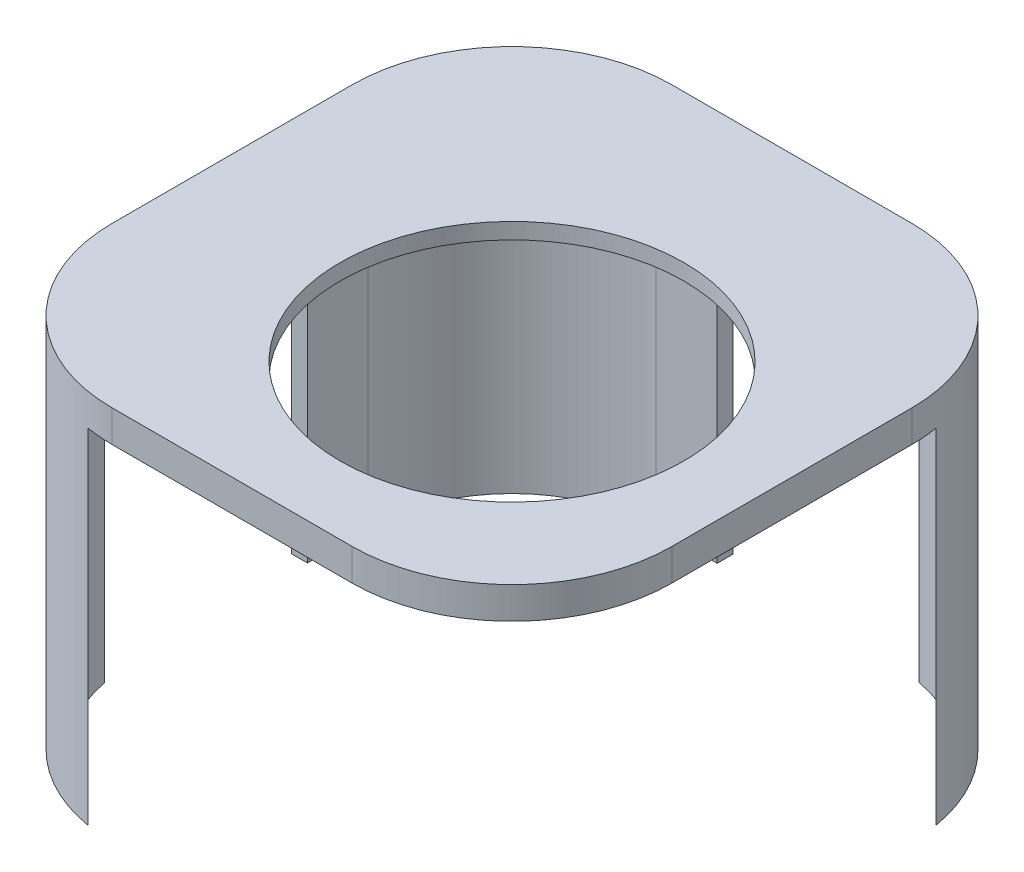
ISO-10303-21;
HEADER;
FILE_DESCRIPTION(('STEP AP214'),'2;1');
FILE_NAME('part.step','',(''),(''),'','','');
FILE_SCHEMA(('AUTOMOTIVE_DESIGN { 1 0 10303 214 1 1 1 1 }'));
ENDSEC;
DATA;
#1=APPLICATION_CONTEXT('core data for automotive mechanical design processes');
#2=APPLICATION_PROTOCOL_DEFINITION('international standard','automotive_design',2000,#1);
#3=PRODUCT_CONTEXT('',#1,'mechanical');
#4=PRODUCT('Part','Part','',(#3));
#5=PRODUCT_RELATED_PRODUCT_CATEGORY('part','',(#4));
#6=PRODUCT_DEFINITION_FORMATION('','',#4);
#7=PRODUCT_DEFINITION_CONTEXT('part definition',#1,'design');
#8=PRODUCT_DEFINITION('design','',#6,#7);
#9=PRODUCT_DEFINITION_SHAPE('','',#8);
#10=(LENGTH_UNIT() NAMED_UNIT(*) SI_UNIT(.MILLI.,.METRE.));
#11=(NAMED_UNIT(*) PLANE_ANGLE_UNIT() SI_UNIT($,.RADIAN.));
#12=(NAMED_UNIT(*) SI_UNIT($,.STERADIAN.) SOLID_ANGLE_UNIT());
#13=UNCERTAINTY_MEASURE_WITH_UNIT(LENGTH_MEASURE(1.E-05),#10,'distance_accuracy_value','');
#14=(GEOMETRIC_REPRESENTATION_CONTEXT(3) GLOBAL_UNCERTAINTY_ASSIGNED_CONTEXT((#13)) GLOBAL_UNIT_ASSIGNED_CONTEXT((#10,
#11,#12)) REPRESENTATION_CONTEXT('',''));
#15=CARTESIAN_POINT('',(0.,0.,0.));
#16=DIRECTION('',(0.,0.,1.));
#17=DIRECTION('',(1.,0.,0.));
#18=AXIS2_PLACEMENT_3D('',#15,#16,#17);
#19=CARTESIAN_POINT('',(0.,0.,0.));
#20=DIRECTION('',(0.,-1.,0.));
#21=DIRECTION('',(0.,0.,-1.));
#22=AXIS2_PLACEMENT_3D('',#19,#20,#21);
#23=PLANE('',#22);
#24=DIRECTION('',(0.,0.,1.));
#25=VECTOR('',#24,1.);
#26=CARTESIAN_POINT('',(-33.,0.,0.));
#27=LINE('',#26,#25);
#28=CARTESIAN_POINT('',(-33.,0.,-15.));
#29=VERTEX_POINT('',#28);
#30=CARTESIAN_POINT('',(-33.,0.,-7.41026140293855));
#31=VERTEX_POINT('',#30);
#32=EDGE_CURVE('E319',#29,#31,#27,.T.);
#33=ORIENTED_EDGE('',*,*,#32,.T.);
#34=DIRECTION('',(-1.,0.,0.));
#35=VECTOR('',#34,1.);
#36=CARTESIAN_POINT('',(-25.,0.,-7.41026140293855));
#37=LINE('',#36,#35);
#38=CARTESIAN_POINT('',(-35.,0.,-7.41026140293855));
#39=VERTEX_POINT('',#38);
#40=EDGE_CURVE('E223',#31,#39,#37,.T.);
#41=ORIENTED_EDGE('',*,*,#40,.T.);
#42=DIRECTION('',(0.,0.,1.));
#43=VECTOR('',#42,1.);
#44=CARTESIAN_POINT('',(-35.,0.,35.));
#45=LINE('',#44,#43);
#46=CARTESIAN_POINT('',(-35.,0.,-15.));
#47=VERTEX_POINT('',#46);
#48=EDGE_CURVE('E239',#47,#39,#45,.T.);
#49=ORIENTED_EDGE('',*,*,#48,.F.);
#50=CARTESIAN_POINT('',(-15.,0.,-15.));
#51=DIRECTION('',(0.,-1.,0.));
#52=DIRECTION('',(0.,0.,-1.));
#53=AXIS2_PLACEMENT_3D('',#50,#51,#52);
#54=CIRCLE('',#53,20.);
#55=CARTESIAN_POINT('',(-15.,0.,-35.));
#56=VERTEX_POINT('',#55);
#57=EDGE_CURVE('E389',#47,#56,#54,.T.);
#58=ORIENTED_EDGE('',*,*,#57,.T.);
#59=DIRECTION('',(-1.,0.,0.));
#60=VECTOR('',#59,1.);
#61=CARTESIAN_POINT('',(-35.,0.,-35.));
#62=LINE('',#61,#60);
#63=CARTESIAN_POINT('',(-7.33521783819668,0.,-35.));
#64=VERTEX_POINT('',#63);
#65=EDGE_CURVE('E346',#64,#56,#62,.T.);
#66=ORIENTED_EDGE('',*,*,#65,.F.);
#67=DIRECTION('',(0.,0.,-1.));
#68=VECTOR('',#67,1.);
#69=CARTESIAN_POINT('',(-7.33521783819668,0.,-25.));
#70=LINE('',#69,#68);
#71=CARTESIAN_POINT('',(-7.33521783819668,0.,-33.));
#72=VERTEX_POINT('',#71);
#73=EDGE_CURVE('E257',#72,#64,#70,.T.);
#74=ORIENTED_EDGE('',*,*,#73,.F.);
#75=DIRECTION('',(-1.,0.,0.));
#76=VECTOR('',#75,1.);
#77=CARTESIAN_POINT('',(0.,0.,-33.));
#78=LINE('',#77,#76);
#79=CARTESIAN_POINT('',(-15.,0.,-33.));
#80=VERTEX_POINT('',#79);
#81=EDGE_CURVE('E363',#72,#80,#78,.T.);
#82=ORIENTED_EDGE('',*,*,#81,.T.);
#83=CARTESIAN_POINT('',(-15.,0.,-15.));
#84=DIRECTION('',(0.,-1.,0.));
#85=DIRECTION('',(0.,0.,-1.));
#86=AXIS2_PLACEMENT_3D('',#83,#84,#85);
#87=CIRCLE('',#86,18.);
#88=EDGE_CURVE('E360',#29,#80,#87,.T.);
#89=ORIENTED_EDGE('',*,*,#88,.F.);
#90=EDGE_LOOP('',(#33,#41,#49,#58,#66,#74,#82,#89));
#91=FACE_BOUND('',#90,.T.);
#92=ADVANCED_FACE('F33',(#91),#23,.T.);
#93=CARTESIAN_POINT('',(-15.,47.,15.));
#94=DIRECTION('',(0.,-1.,0.));
#95=DIRECTION('',(0.,0.,-1.));
#96=AXIS2_PLACEMENT_3D('',#93,#94,#95);
#97=CYLINDRICAL_SURFACE('',#96,20.);
#98=DIRECTION('',(0.,-1.,0.));
#99=VECTOR('',#98,1.);
#100=CARTESIAN_POINT('',(-35.,47.,15.));
#101=LINE('',#100,#99);
#102=CARTESIAN_POINT('',(-35.,28.5604552285932,15.));
#103=VERTEX_POINT('',#102);
#104=CARTESIAN_POINT('',(-35.,47.,15.));
#105=VERTEX_POINT('',#104);
#106=EDGE_CURVE('E410',#103,#105,#101,.F.);
#107=ORIENTED_EDGE('',*,*,#106,.F.);
#108=CARTESIAN_POINT('',(-15.,28.5604552285932,15.));
#109=DIRECTION('',(0.,-1.,0.));
#110=DIRECTION('',(0.,0.,-1.));
#111=AXIS2_PLACEMENT_3D('',#108,#109,#110);
#112=CIRCLE('',#111,20.);
#113=CARTESIAN_POINT('',(-34.7322185635075,28.5604552285932,18.2618323932981));
#114=VERTEX_POINT('',#113);
#115=EDGE_CURVE('E231',#103,#114,#112,.F.);
#116=ORIENTED_EDGE('',*,*,#115,.T.);
#117=DIRECTION('',(0.,-1.,0.));
#118=VECTOR('',#117,1.);
#119=CARTESIAN_POINT('',(-34.7322185635075,47.,18.2618323932981));
#120=LINE('',#119,#118);
#121=CARTESIAN_POINT('',(-34.7322185635075,0.,18.2618323932981));
#122=VERTEX_POINT('',#121);
#123=EDGE_CURVE('E249',#122,#114,#120,.F.);
#124=ORIENTED_EDGE('',*,*,#123,.F.);
#125=CARTESIAN_POINT('',(-15.,0.,15.));
#126=DIRECTION('',(0.,-1.,0.));
#127=DIRECTION('',(0.,0.,-1.));
#128=AXIS2_PLACEMENT_3D('',#125,#126,#127);
#129=CIRCLE('',#128,20.);
#130=CARTESIAN_POINT('',(-18.3085734447097,0.,34.7244351442814));
#131=VERTEX_POINT('',#130);
#132=EDGE_CURVE('E392',#131,#122,#129,.T.);
#133=ORIENTED_EDGE('',*,*,#132,.F.);
#134=DIRECTION('',(0.,-1.,0.));
#135=VECTOR('',#134,1.);
#136=CARTESIAN_POINT('',(-18.3085734447097,47.,34.7244351442814));
#137=LINE('',#136,#135);
#138=CARTESIAN_POINT('',(-18.3085734447097,43.0241572357972,34.7244351442814));
#139=VERTEX_POINT('',#138);
#140=EDGE_CURVE('E308',#131,#139,#137,.F.);
#141=ORIENTED_EDGE('',*,*,#140,.T.);
#142=CARTESIAN_POINT('',(-15.,43.0241572357972,15.));
#143=DIRECTION('',(0.,-1.,0.));
#144=DIRECTION('',(0.,0.,-1.));
#145=AXIS2_PLACEMENT_3D('',#142,#143,#144);
#146=CIRCLE('',#145,20.);
#147=CARTESIAN_POINT('',(-15.,43.0241572357972,35.));
#148=VERTEX_POINT('',#147);
#149=EDGE_CURVE('E302',#139,#148,#146,.F.);
#150=ORIENTED_EDGE('',*,*,#149,.T.);
#151=DIRECTION('',(0.,-1.,0.));
#152=VECTOR('',#151,1.);
#153=CARTESIAN_POINT('',(-15.,47.,35.));
#154=LINE('',#153,#152);
#155=CARTESIAN_POINT('',(-15.,47.,35.));
#156=VERTEX_POINT('',#155);
#157=EDGE_CURVE('E395',#156,#148,#154,.T.);
#158=ORIENTED_EDGE('',*,*,#157,.F.);
#159=CARTESIAN_POINT('',(-15.,47.,15.));
#160=DIRECTION('',(0.,-1.,0.));
#161=DIRECTION('',(0.,0.,-1.));
#162=AXIS2_PLACEMENT_3D('',#159,#160,#161);
#163=CIRCLE('',#162,20.);
#164=EDGE_CURVE('E404',#105,#156,#163,.F.);
#165=ORIENTED_EDGE('',*,*,#164,.F.);
#166=EDGE_LOOP('',(#107,#116,#124,#133,#141,#150,#158,#165));
#167=FACE_BOUND('',#166,.T.);
#168=ADVANCED_FACE('F468',(#167),#97,.T.);
#169=CARTESIAN_POINT('',(-15.,47.,15.));
#170=DIRECTION('',(0.,-1.,0.));
#171=DIRECTION('',(0.,0.,-1.));
#172=AXIS2_PLACEMENT_3D('',#169,#170,#171);
#173=CYLINDRICAL_SURFACE('',#172,18.);
#174=CARTESIAN_POINT('',(-15.,28.5604552285932,15.));
#175=DIRECTION('',(0.,-1.,0.));
#176=DIRECTION('',(0.,0.,-1.));
#177=AXIS2_PLACEMENT_3D('',#174,#175,#176);
#178=CIRCLE('',#177,18.);
#179=CARTESIAN_POINT('',(-33.,28.5604552285932,15.));
#180=VERTEX_POINT('',#179);
#181=CARTESIAN_POINT('',(-32.7019899852539,28.5604552285932,18.2618323932981));
#182=VERTEX_POINT('',#181);
#183=EDGE_CURVE('E244',#180,#182,#178,.F.);
#184=ORIENTED_EDGE('',*,*,#183,.F.);
#185=DIRECTION('',(0.,1.,0.));
#186=VECTOR('',#185,1.);
#187=CARTESIAN_POINT('',(-33.,47.,15.));
#188=LINE('',#187,#186);
#189=CARTESIAN_POINT('',(-33.,45.,15.));
#190=VERTEX_POINT('',#189);
#191=EDGE_CURVE('E350',#180,#190,#188,.T.);
#192=ORIENTED_EDGE('',*,*,#191,.T.);
#193=CARTESIAN_POINT('',(-15.,45.,15.));
#194=DIRECTION('',(0.,-1.,0.));
#195=DIRECTION('',(0.,0.,-1.));
#196=AXIS2_PLACEMENT_3D('',#193,#194,#195);
#197=CIRCLE('',#196,18.);
#198=CARTESIAN_POINT('',(-15.,45.,33.));
#199=VERTEX_POINT('',#198);
#200=EDGE_CURVE('E333',#190,#199,#197,.F.);
#201=ORIENTED_EDGE('',*,*,#200,.T.);
#202=DIRECTION('',(0.,1.,0.));
#203=VECTOR('',#202,1.);
#204=CARTESIAN_POINT('',(-15.,47.,33.));
#205=LINE('',#204,#203);
#206=CARTESIAN_POINT('',(-15.,43.0241572357972,33.));
#207=VERTEX_POINT('',#206);
#208=EDGE_CURVE('E353',#199,#207,#205,.F.);
#209=ORIENTED_EDGE('',*,*,#208,.T.);
#210=CARTESIAN_POINT('',(-15.,43.0241572357972,15.));
#211=DIRECTION('',(0.,-1.,0.));
#212=DIRECTION('',(0.,0.,-1.));
#213=AXIS2_PLACEMENT_3D('',#210,#211,#212);
#214=CIRCLE('',#213,18.);
#215=CARTESIAN_POINT('',(-21.0970828461428,43.0241572357972,31.9359257428483));
#216=VERTEX_POINT('',#215);
#217=EDGE_CURVE('E290',#216,#207,#214,.F.);
#218=ORIENTED_EDGE('',*,*,#217,.F.);
#219=DIRECTION('',(0.,-1.,0.));
#220=VECTOR('',#219,1.);
#221=CARTESIAN_POINT('',(-21.0970828461428,47.,31.9359257428483));
#222=LINE('',#221,#220);
#223=CARTESIAN_POINT('',(-21.0970828461428,0.,31.9359257428483));
#224=VERTEX_POINT('',#223);
#225=EDGE_CURVE('E424',#224,#216,#222,.F.);
#226=ORIENTED_EDGE('',*,*,#225,.F.);
#227=CARTESIAN_POINT('',(-15.,0.,15.));
#228=DIRECTION('',(0.,-1.,0.));
#229=DIRECTION('',(0.,0.,-1.));
#230=AXIS2_PLACEMENT_3D('',#227,#228,#229);
#231=CIRCLE('',#230,18.);
#232=CARTESIAN_POINT('',(-32.7019899852539,0.,18.2618323932981));
#233=VERTEX_POINT('',#232);
#234=EDGE_CURVE('E356',#224,#233,#231,.T.);
#235=ORIENTED_EDGE('',*,*,#234,.T.);
#236=DIRECTION('',(0.,-1.,0.));
#237=VECTOR('',#236,1.);
#238=CARTESIAN_POINT('',(-32.7019899852539,47.,18.2618323932981));
#239=LINE('',#238,#237);
#240=EDGE_CURVE('E11',#233,#182,#239,.F.);
#241=ORIENTED_EDGE('',*,*,#240,.T.);
#242=EDGE_LOOP('',(#184,#192,#201,#209,#218,#226,#235,#241));
#243=FACE_BOUND('',#242,.T.);
#244=ADVANCED_FACE('F460',(#243),#173,.F.);
#245=CARTESIAN_POINT('',(-35.,47.,35.));
#246=DIRECTION('',(1.,0.,0.));
#247=DIRECTION('',(0.,0.,-1.));
#248=AXIS2_PLACEMENT_3D('',#245,#246,#247);
#249=PLANE('',#248);
#250=DIRECTION('',(0.,1.,0.));
#251=VECTOR('',#250,1.);
#252=CARTESIAN_POINT('',(-35.,0.,-7.41026140293855));
#253=LINE('',#252,#251);
#254=CARTESIAN_POINT('',(-35.,28.5604552285932,-7.41026140293855));
#255=VERTEX_POINT('',#254);
#256=EDGE_CURVE('E219',#39,#255,#253,.T.);
#257=ORIENTED_EDGE('',*,*,#256,.T.);
#258=DIRECTION('',(0.,0.,1.));
#259=VECTOR('',#258,1.);
#260=CARTESIAN_POINT('',(-35.,28.5604552285932,-7.41026140293855));
#261=LINE('',#260,#259);
#262=EDGE_CURVE('E227',#255,#103,#261,.T.);
#263=ORIENTED_EDGE('',*,*,#262,.T.);
#264=ORIENTED_EDGE('',*,*,#106,.T.);
#265=DIRECTION('',(0.,0.,1.));
#266=VECTOR('',#265,1.);
#267=CARTESIAN_POINT('',(-35.,47.,35.));
#268=LINE('',#267,#266);
#269=CARTESIAN_POINT('',(-35.,47.,-15.));
#270=VERTEX_POINT('',#269);
#271=EDGE_CURVE('E374',#270,#105,#268,.T.);
#272=ORIENTED_EDGE('',*,*,#271,.F.);
#273=DIRECTION('',(0.,-1.,0.));
#274=VECTOR('',#273,1.);
#275=CARTESIAN_POINT('',(-35.,47.,-15.));
#276=LINE('',#275,#274);
#277=EDGE_CURVE('E408',#270,#47,#276,.T.);
#278=ORIENTED_EDGE('',*,*,#277,.T.);
#279=ORIENTED_EDGE('',*,*,#48,.T.);
#280=EDGE_LOOP('',(#257,#263,#264,#272,#278,#279));
#281=FACE_BOUND('',#280,.T.);
#282=ADVANCED_FACE('F236',(#281),#249,.F.);
#283=CARTESIAN_POINT('',(-33.,47.,35.));
#284=DIRECTION('',(1.,0.,0.));
#285=DIRECTION('',(0.,0.,-1.));
#286=AXIS2_PLACEMENT_3D('',#283,#284,#285);
#287=PLANE('',#286);
#288=DIRECTION('',(0.,0.,-1.));
#289=VECTOR('',#288,1.);
#290=CARTESIAN_POINT('',(-33.,28.5604552285932,35.));
#291=LINE('',#290,#289);
#292=CARTESIAN_POINT('',(-33.,28.5604552285932,-7.41026140293854));
#293=VERTEX_POINT('',#292);
#294=EDGE_CURVE('E433',#180,#293,#291,.T.);
#295=ORIENTED_EDGE('',*,*,#294,.T.);
#296=DIRECTION('',(0.,-1.,0.));
#297=VECTOR('',#296,1.);
#298=CARTESIAN_POINT('',(-33.,47.,-7.41026140293854));
#299=LINE('',#298,#297);
#300=EDGE_CURVE('E41',#293,#31,#299,.T.);
#301=ORIENTED_EDGE('',*,*,#300,.T.);
#302=ORIENTED_EDGE('',*,*,#32,.F.);
#303=DIRECTION('',(0.,1.,0.));
#304=VECTOR('',#303,1.);
#305=CARTESIAN_POINT('',(-33.,47.,-15.));
#306=LINE('',#305,#304);
#307=CARTESIAN_POINT('',(-33.,45.,-15.));
#308=VERTEX_POINT('',#307);
#309=EDGE_CURVE('E332',#308,#29,#306,.F.);
#310=ORIENTED_EDGE('',*,*,#309,.F.);
#311=DIRECTION('',(0.,0.,1.));
#312=VECTOR('',#311,1.);
#313=CARTESIAN_POINT('',(-33.,45.,0.));
#314=LINE('',#313,#312);
#315=EDGE_CURVE('E329',#308,#190,#314,.T.);
#316=ORIENTED_EDGE('',*,*,#315,.T.);
#317=ORIENTED_EDGE('',*,*,#191,.F.);
#318=EDGE_LOOP('',(#295,#301,#302,#310,#316,#317));
#319=FACE_BOUND('',#318,.T.);
#320=ADVANCED_FACE('F436',(#319),#287,.T.);
#321=DIRECTION('',(-1.,0.,0.));
#322=VECTOR('',#321,1.);
#323=CARTESIAN_POINT('',(-25.,0.,18.2618323932981));
#324=LINE('',#323,#322);
#325=EDGE_CURVE('E240',#233,#122,#324,.T.);
#326=ORIENTED_EDGE('',*,*,#325,.F.);
#327=ORIENTED_EDGE('',*,*,#234,.F.);
#328=DIRECTION('',(-0.707106781186547,0.,-0.707106781186548));
#329=VECTOR('',#328,1.);
#330=CARTESIAN_POINT('',(8.48349570550447,0.,61.5165042944955));
#331=LINE('',#330,#329);
#332=EDGE_CURVE('E274',#131,#224,#331,.T.);
#333=ORIENTED_EDGE('',*,*,#332,.F.);
#334=ORIENTED_EDGE('',*,*,#132,.T.);
#335=EDGE_LOOP('',(#326,#327,#333,#334));
#336=FACE_BOUND('',#335,.T.);
#337=ADVANCED_FACE('F471',(#336),#23,.T.);
#338=DIRECTION('',(0.,0.,-1.));
#339=VECTOR('',#338,1.);
#340=CARTESIAN_POINT('',(18.2134747115512,0.,-25.));
#341=LINE('',#340,#339);
#342=CARTESIAN_POINT('',(18.2134747115512,0.,-32.7108322864348));
#343=VERTEX_POINT('',#342);
#344=CARTESIAN_POINT('',(18.2134747115512,0.,-34.7401514755642));
#345=VERTEX_POINT('',#344);
#346=EDGE_CURVE('E259',#343,#345,#341,.T.);
#347=ORIENTED_EDGE('',*,*,#346,.T.);
#348=CARTESIAN_POINT('',(15.,0.,-15.));
#349=DIRECTION('',(0.,-1.,0.));
#350=DIRECTION('',(0.,0.,-1.));
#351=AXIS2_PLACEMENT_3D('',#348,#349,#350);
#352=CIRCLE('',#351,20.);
#353=CARTESIAN_POINT('',(34.7244351442814,0.,-18.3085734447097));
#354=VERTEX_POINT('',#353);
#355=EDGE_CURVE('E387',#345,#354,#352,.T.);
#356=ORIENTED_EDGE('',*,*,#355,.T.);
#357=DIRECTION('',(-0.707106781186547,0.,-0.707106781186548));
#358=VECTOR('',#357,1.);
#359=CARTESIAN_POINT('',(61.5165042944955,0.,8.48349570550449));
#360=LINE('',#359,#358);
#361=CARTESIAN_POINT('',(31.9359257428483,0.,-21.0970828461427));
#362=VERTEX_POINT('',#361);
#363=EDGE_CURVE('E271',#354,#362,#360,.T.);
#364=ORIENTED_EDGE('',*,*,#363,.T.);
#365=CARTESIAN_POINT('',(15.,0.,-15.));
#366=DIRECTION('',(0.,-1.,0.));
#367=DIRECTION('',(0.,0.,-1.));
#368=AXIS2_PLACEMENT_3D('',#365,#366,#367);
#369=CIRCLE('',#368,18.);
#370=EDGE_CURVE('E323',#343,#362,#369,.T.);
#371=ORIENTED_EDGE('',*,*,#370,.F.);
#372=EDGE_LOOP('',(#347,#356,#364,#371));
#373=FACE_BOUND('',#372,.T.);
#374=ADVANCED_FACE('F541',(#373),#23,.T.);
#375=CARTESIAN_POINT('',(35.,47.,35.));
#376=DIRECTION('',(-1.,0.,0.));
#377=DIRECTION('',(0.,0.,1.));
#378=AXIS2_PLACEMENT_3D('',#375,#376,#377);
#379=PLANE('',#378);
#380=DIRECTION('',(0.,0.,1.));
#381=VECTOR('',#380,1.);
#382=CARTESIAN_POINT('',(35.,43.0241572357972,35.));
#383=LINE('',#382,#381);
#384=CARTESIAN_POINT('',(35.,43.0241572357972,-15.));
#385=VERTEX_POINT('',#384);
#386=CARTESIAN_POINT('',(35.,43.0241572357972,15.));
#387=VERTEX_POINT('',#386);
#388=EDGE_CURVE('E295',#385,#387,#383,.T.);
#389=ORIENTED_EDGE('',*,*,#388,.F.);
#390=DIRECTION('',(0.,-1.,0.));
#391=VECTOR('',#390,1.);
#392=CARTESIAN_POINT('',(35.,47.,-15.));
#393=LINE('',#392,#391);
#394=CARTESIAN_POINT('',(35.,47.,-15.));
#395=VERTEX_POINT('',#394);
#396=EDGE_CURVE('E380',#385,#395,#393,.F.);
#397=ORIENTED_EDGE('',*,*,#396,.T.);
#398=DIRECTION('',(0.,0.,-1.));
#399=VECTOR('',#398,1.);
#400=CARTESIAN_POINT('',(35.,47.,35.));
#401=LINE('',#400,#399);
#402=CARTESIAN_POINT('',(35.,47.,15.));
#403=VERTEX_POINT('',#402);
#404=EDGE_CURVE('E368',#403,#395,#401,.T.);
#405=ORIENTED_EDGE('',*,*,#404,.F.);
#406=DIRECTION('',(0.,-1.,0.));
#407=VECTOR('',#406,1.);
#408=CARTESIAN_POINT('',(35.,47.,15.));
#409=LINE('',#408,#407);
#410=EDGE_CURVE('E384',#403,#387,#409,.T.);
#411=ORIENTED_EDGE('',*,*,#410,.T.);
#412=EDGE_LOOP('',(#389,#397,#405,#411));
#413=FACE_BOUND('',#412,.T.);
#414=ADVANCED_FACE('F508',(#413),#379,.F.);
#415=CARTESIAN_POINT('',(-35.,47.,35.));
#416=DIRECTION('',(0.,0.,-1.));
#417=DIRECTION('',(-1.,0.,0.));
#418=AXIS2_PLACEMENT_3D('',#415,#416,#417);
#419=PLANE('',#418);
#420=DIRECTION('',(-1.,0.,0.));
#421=VECTOR('',#420,1.);
#422=CARTESIAN_POINT('',(-35.,43.0241572357972,35.));
#423=LINE('',#422,#421);
#424=CARTESIAN_POINT('',(15.,43.0241572357972,35.));
#425=VERTEX_POINT('',#424);
#426=EDGE_CURVE('E300',#425,#148,#423,.T.);
#427=ORIENTED_EDGE('',*,*,#426,.F.);
#428=DIRECTION('',(0.,-1.,0.));
#429=VECTOR('',#428,1.);
#430=CARTESIAN_POINT('',(15.,47.,35.));
#431=LINE('',#430,#429);
#432=CARTESIAN_POINT('',(15.,47.,35.));
#433=VERTEX_POINT('',#432);
#434=EDGE_CURVE('E398',#425,#433,#431,.F.);
#435=ORIENTED_EDGE('',*,*,#434,.T.);
#436=DIRECTION('',(1.,0.,0.));
#437=VECTOR('',#436,1.);
#438=CARTESIAN_POINT('',(-35.,47.,35.));
#439=LINE('',#438,#437);
#440=EDGE_CURVE('E377',#156,#433,#439,.T.);
#441=ORIENTED_EDGE('',*,*,#440,.F.);
#442=ORIENTED_EDGE('',*,*,#157,.T.);
#443=EDGE_LOOP('',(#427,#435,#441,#442));
#444=FACE_BOUND('',#443,.T.);
#445=ADVANCED_FACE('F517',(#444),#419,.F.);
#446=CARTESIAN_POINT('',(15.,47.,15.));
#447=DIRECTION('',(0.,-1.,0.));
#448=DIRECTION('',(0.,0.,-1.));
#449=AXIS2_PLACEMENT_3D('',#446,#447,#448);
#450=CYLINDRICAL_SURFACE('',#449,20.);
#451=ORIENTED_EDGE('',*,*,#434,.F.);
#452=CARTESIAN_POINT('',(15.,43.0241572357972,15.));
#453=DIRECTION('',(0.,-1.,0.));
#454=DIRECTION('',(0.,0.,-1.));
#455=AXIS2_PLACEMENT_3D('',#452,#453,#454);
#456=CIRCLE('',#455,20.);
#457=EDGE_CURVE('E297',#425,#387,#456,.F.);
#458=ORIENTED_EDGE('',*,*,#457,.T.);
#459=ORIENTED_EDGE('',*,*,#410,.F.);
#460=CARTESIAN_POINT('',(15.,47.,15.));
#461=DIRECTION('',(0.,-1.,0.));
#462=DIRECTION('',(0.,0.,-1.));
#463=AXIS2_PLACEMENT_3D('',#460,#461,#462);
#464=CIRCLE('',#463,20.);
#465=EDGE_CURVE('E406',#433,#403,#464,.F.);
#466=ORIENTED_EDGE('',*,*,#465,.F.);
#467=EDGE_LOOP('',(#451,#458,#459,#466));
#468=FACE_BOUND('',#467,.T.);
#469=ADVANCED_FACE('F514',(#468),#450,.T.);
#470=CARTESIAN_POINT('',(15.,47.,-15.));
#471=DIRECTION('',(0.,-1.,0.));
#472=DIRECTION('',(0.,0.,-1.));
#473=AXIS2_PLACEMENT_3D('',#470,#471,#472);
#474=CYLINDRICAL_SURFACE('',#473,20.);
#475=DIRECTION('',(0.,-1.,0.));
#476=VECTOR('',#475,1.);
#477=CARTESIAN_POINT('',(18.2134747115512,47.,-34.7401514755642));
#478=LINE('',#477,#476);
#479=CARTESIAN_POINT('',(18.2134747115512,28.8007936659369,-34.7401514755642));
#480=VERTEX_POINT('',#479);
#481=EDGE_CURVE('E269',#480,#345,#478,.T.);
#482=ORIENTED_EDGE('',*,*,#481,.F.);
#483=CARTESIAN_POINT('',(15.,28.8007936659369,-15.));
#484=DIRECTION('',(0.,1.,0.));
#485=DIRECTION('',(-1.,0.,0.));
#486=AXIS2_PLACEMENT_3D('',#483,#484,#485);
#487=CIRCLE('',#486,20.);
#488=CARTESIAN_POINT('',(15.,28.8007936659369,-35.));
#489=VERTEX_POINT('',#488);
#490=EDGE_CURVE('E267',#489,#480,#487,.F.);
#491=ORIENTED_EDGE('',*,*,#490,.F.);
#492=DIRECTION('',(0.,-1.,0.));
#493=VECTOR('',#492,1.);
#494=CARTESIAN_POINT('',(15.,47.,-35.));
#495=LINE('',#494,#493);
#496=CARTESIAN_POINT('',(15.,47.,-35.));
#497=VERTEX_POINT('',#496);
#498=EDGE_CURVE('E412',#497,#489,#495,.T.);
#499=ORIENTED_EDGE('',*,*,#498,.F.);
#500=CARTESIAN_POINT('',(15.,47.,-15.));
#501=DIRECTION('',(0.,-1.,0.));
#502=DIRECTION('',(0.,0.,-1.));
#503=AXIS2_PLACEMENT_3D('',#500,#501,#502);
#504=CIRCLE('',#503,20.);
#505=EDGE_CURVE('E400',#395,#497,#504,.F.);
#506=ORIENTED_EDGE('',*,*,#505,.F.);
#507=ORIENTED_EDGE('',*,*,#396,.F.);
#508=CARTESIAN_POINT('',(15.,43.0241572357972,-15.));
#509=DIRECTION('',(0.,-1.,0.));
#510=DIRECTION('',(0.,0.,-1.));
#511=AXIS2_PLACEMENT_3D('',#508,#509,#510);
#512=CIRCLE('',#511,20.);
#513=CARTESIAN_POINT('',(34.7244351442814,43.0241572357972,-18.3085734447097));
#514=VERTEX_POINT('',#513);
#515=EDGE_CURVE('E292',#385,#514,#512,.F.);
#516=ORIENTED_EDGE('',*,*,#515,.T.);
#517=DIRECTION('',(0.,-1.,0.));
#518=VECTOR('',#517,1.);
#519=CARTESIAN_POINT('',(34.7244351442814,47.,-18.3085734447097));
#520=LINE('',#519,#518);
#521=EDGE_CURVE('E305',#514,#354,#520,.T.);
#522=ORIENTED_EDGE('',*,*,#521,.T.);
#523=ORIENTED_EDGE('',*,*,#355,.F.);
#524=EDGE_LOOP('',(#482,#491,#499,#506,#507,#516,#522,#523));
#525=FACE_BOUND('',#524,.T.);
#526=ADVANCED_FACE('F35',(#525),#474,.T.);
#527=CARTESIAN_POINT('',(33.,47.,35.));
#528=DIRECTION('',(-1.,0.,0.));
#529=DIRECTION('',(0.,0.,1.));
#530=AXIS2_PLACEMENT_3D('',#527,#528,#529);
#531=PLANE('',#530);
#532=DIRECTION('',(0.,1.,0.));
#533=VECTOR('',#532,1.);
#534=CARTESIAN_POINT('',(33.,47.,-15.));
#535=LINE('',#534,#533);
#536=CARTESIAN_POINT('',(33.,43.0241572357972,-15.));
#537=VERTEX_POINT('',#536);
#538=CARTESIAN_POINT('',(33.,45.,-15.));
#539=VERTEX_POINT('',#538);
#540=EDGE_CURVE('E324',#537,#539,#535,.T.);
#541=ORIENTED_EDGE('',*,*,#540,.F.);
#542=DIRECTION('',(0.,0.,1.));
#543=VECTOR('',#542,1.);
#544=CARTESIAN_POINT('',(33.,43.0241572357972,35.));
#545=LINE('',#544,#543);
#546=CARTESIAN_POINT('',(33.,43.0241572357972,15.));
#547=VERTEX_POINT('',#546);
#548=EDGE_CURVE('E282',#537,#547,#545,.T.);
#549=ORIENTED_EDGE('',*,*,#548,.T.);
#550=DIRECTION('',(0.,1.,0.));
#551=VECTOR('',#550,1.);
#552=CARTESIAN_POINT('',(33.,47.,15.));
#553=LINE('',#552,#551);
#554=CARTESIAN_POINT('',(33.,45.,15.));
#555=VERTEX_POINT('',#554);
#556=EDGE_CURVE('E320',#555,#547,#553,.F.);
#557=ORIENTED_EDGE('',*,*,#556,.F.);
#558=DIRECTION('',(0.,0.,-1.));
#559=VECTOR('',#558,1.);
#560=CARTESIAN_POINT('',(33.,45.,0.));
#561=LINE('',#560,#559);
#562=EDGE_CURVE('E315',#555,#539,#561,.T.);
#563=ORIENTED_EDGE('',*,*,#562,.T.);
#564=EDGE_LOOP('',(#541,#549,#557,#563));
#565=FACE_BOUND('',#564,.T.);
#566=ADVANCED_FACE('F493',(#565),#531,.T.);
#567=CARTESIAN_POINT('',(-35.,47.,33.));
#568=DIRECTION('',(0.,0.,-1.));
#569=DIRECTION('',(-1.,0.,0.));
#570=AXIS2_PLACEMENT_3D('',#567,#568,#569);
#571=PLANE('',#570);
#572=DIRECTION('',(0.,1.,0.));
#573=VECTOR('',#572,1.);
#574=CARTESIAN_POINT('',(15.,47.,33.));
#575=LINE('',#574,#573);
#576=CARTESIAN_POINT('',(15.,43.0241572357972,33.));
#577=VERTEX_POINT('',#576);
#578=CARTESIAN_POINT('',(15.,45.,33.));
#579=VERTEX_POINT('',#578);
#580=EDGE_CURVE('E337',#577,#579,#575,.T.);
#581=ORIENTED_EDGE('',*,*,#580,.F.);
#582=DIRECTION('',(-1.,0.,0.));
#583=VECTOR('',#582,1.);
#584=CARTESIAN_POINT('',(-35.,43.0241572357972,33.));
#585=LINE('',#584,#583);
#586=EDGE_CURVE('E287',#577,#207,#585,.T.);
#587=ORIENTED_EDGE('',*,*,#586,.T.);
#588=ORIENTED_EDGE('',*,*,#208,.F.);
#589=DIRECTION('',(1.,0.,0.));
#590=VECTOR('',#589,1.);
#591=CARTESIAN_POINT('',(0.,45.,33.));
#592=LINE('',#591,#590);
#593=EDGE_CURVE('E326',#199,#579,#592,.T.);
#594=ORIENTED_EDGE('',*,*,#593,.T.);
#595=EDGE_LOOP('',(#581,#587,#588,#594));
#596=FACE_BOUND('',#595,.T.);
#597=ADVANCED_FACE('F484',(#596),#571,.T.);
#598=CARTESIAN_POINT('',(15.,47.,15.));
#599=DIRECTION('',(0.,-1.,0.));
#600=DIRECTION('',(0.,0.,-1.));
#601=AXIS2_PLACEMENT_3D('',#598,#599,#600);
#602=CYLINDRICAL_SURFACE('',#601,18.);
#603=CARTESIAN_POINT('',(15.,43.0241572357972,15.));
#604=DIRECTION('',(0.,-1.,0.));
#605=DIRECTION('',(0.,0.,-1.));
#606=AXIS2_PLACEMENT_3D('',#603,#604,#605);
#607=CIRCLE('',#606,18.);
#608=EDGE_CURVE('E285',#577,#547,#607,.F.);
#609=ORIENTED_EDGE('',*,*,#608,.F.);
#610=ORIENTED_EDGE('',*,*,#580,.T.);
#611=CARTESIAN_POINT('',(15.,45.,15.));
#612=DIRECTION('',(0.,-1.,0.));
#613=DIRECTION('',(0.,0.,-1.));
#614=AXIS2_PLACEMENT_3D('',#611,#612,#613);
#615=CIRCLE('',#614,18.);
#616=EDGE_CURVE('E330',#579,#555,#615,.F.);
#617=ORIENTED_EDGE('',*,*,#616,.T.);
#618=ORIENTED_EDGE('',*,*,#556,.T.);
#619=EDGE_LOOP('',(#609,#610,#617,#618));
#620=FACE_BOUND('',#619,.T.);
#621=ADVANCED_FACE('F487',(#620),#602,.F.);
#622=CARTESIAN_POINT('',(15.,47.,-15.));
#623=DIRECTION('',(0.,-1.,0.));
#624=DIRECTION('',(0.,0.,-1.));
#625=AXIS2_PLACEMENT_3D('',#622,#623,#624);
#626=CYLINDRICAL_SURFACE('',#625,18.);
#627=CARTESIAN_POINT('',(15.,28.8007936659369,-15.));
#628=DIRECTION('',(0.,1.,0.));
#629=DIRECTION('',(-1.,0.,0.));
#630=AXIS2_PLACEMENT_3D('',#627,#628,#629);
#631=CIRCLE('',#630,18.);
#632=CARTESIAN_POINT('',(15.,28.8007936659369,-33.));
#633=VERTEX_POINT('',#632);
#634=CARTESIAN_POINT('',(18.2134747115512,28.8007936659369,-32.7108322864348));
#635=VERTEX_POINT('',#634);
#636=EDGE_CURVE('E56',#633,#635,#631,.F.);
#637=ORIENTED_EDGE('',*,*,#636,.T.);
#638=DIRECTION('',(0.,-1.,0.));
#639=VECTOR('',#638,1.);
#640=CARTESIAN_POINT('',(18.2134747115512,47.,-32.7108322864348));
#641=LINE('',#640,#639);
#642=EDGE_CURVE('E430',#635,#343,#641,.T.);
#643=ORIENTED_EDGE('',*,*,#642,.T.);
#644=ORIENTED_EDGE('',*,*,#370,.T.);
#645=DIRECTION('',(0.,-1.,0.));
#646=VECTOR('',#645,1.);
#647=CARTESIAN_POINT('',(31.9359257428483,47.,-21.0970828461427));
#648=LINE('',#647,#646);
#649=CARTESIAN_POINT('',(31.9359257428483,43.0241572357972,-21.0970828461427));
#650=VERTEX_POINT('',#649);
#651=EDGE_CURVE('E421',#650,#362,#648,.T.);
#652=ORIENTED_EDGE('',*,*,#651,.F.);
#653=CARTESIAN_POINT('',(15.,43.0241572357972,-15.));
#654=DIRECTION('',(0.,-1.,0.));
#655=DIRECTION('',(0.,0.,-1.));
#656=AXIS2_PLACEMENT_3D('',#653,#654,#655);
#657=CIRCLE('',#656,18.);
#658=EDGE_CURVE('E417',#537,#650,#657,.F.);
#659=ORIENTED_EDGE('',*,*,#658,.F.);
#660=ORIENTED_EDGE('',*,*,#540,.T.);
#661=CARTESIAN_POINT('',(15.,45.,-15.));
#662=DIRECTION('',(0.,-1.,0.));
#663=DIRECTION('',(0.,0.,-1.));
#664=AXIS2_PLACEMENT_3D('',#661,#662,#663);
#665=CIRCLE('',#664,18.);
#666=CARTESIAN_POINT('',(15.,45.,-33.));
#667=VERTEX_POINT('',#666);
#668=EDGE_CURVE('E334',#539,#667,#665,.F.);
#669=ORIENTED_EDGE('',*,*,#668,.T.);
#670=DIRECTION('',(0.,1.,0.));
#671=VECTOR('',#670,1.);
#672=CARTESIAN_POINT('',(15.,47.,-33.));
#673=LINE('',#672,#671);
#674=EDGE_CURVE('E347',#667,#633,#673,.F.);
#675=ORIENTED_EDGE('',*,*,#674,.T.);
#676=EDGE_LOOP('',(#637,#643,#644,#652,#659,#660,#669,#675));
#677=FACE_BOUND('',#676,.T.);
#678=ADVANCED_FACE('F495',(#677),#626,.F.);
#679=CARTESIAN_POINT('',(-35.,47.,-35.));
#680=DIRECTION('',(0.,0.,1.));
#681=DIRECTION('',(1.,0.,0.));
#682=AXIS2_PLACEMENT_3D('',#679,#680,#681);
#683=PLANE('',#682);
#684=DIRECTION('',(1.,0.,0.));
#685=VECTOR('',#684,1.);
#686=CARTESIAN_POINT('',(-7.33521783819668,28.8007936659369,-35.));
#687=LINE('',#686,#685);
#688=CARTESIAN_POINT('',(-7.33521783819668,28.8007936659369,-35.));
#689=VERTEX_POINT('',#688);
#690=EDGE_CURVE('E254',#689,#489,#687,.T.);
#691=ORIENTED_EDGE('',*,*,#690,.F.);
#692=DIRECTION('',(0.,1.,0.));
#693=VECTOR('',#692,1.);
#694=CARTESIAN_POINT('',(-7.33521783819668,0.,-35.));
#695=LINE('',#694,#693);
#696=EDGE_CURVE('E251',#64,#689,#695,.T.);
#697=ORIENTED_EDGE('',*,*,#696,.F.);
#698=ORIENTED_EDGE('',*,*,#65,.T.);
#699=DIRECTION('',(0.,-1.,0.));
#700=VECTOR('',#699,1.);
#701=CARTESIAN_POINT('',(-15.,47.,-35.));
#702=LINE('',#701,#700);
#703=CARTESIAN_POINT('',(-15.,47.,-35.));
#704=VERTEX_POINT('',#703);
#705=EDGE_CURVE('E415',#56,#704,#702,.F.);
#706=ORIENTED_EDGE('',*,*,#705,.T.);
#707=DIRECTION('',(-1.,0.,0.));
#708=VECTOR('',#707,1.);
#709=CARTESIAN_POINT('',(-35.,47.,-35.));
#710=LINE('',#709,#708);
#711=EDGE_CURVE('E371',#497,#704,#710,.T.);
#712=ORIENTED_EDGE('',*,*,#711,.F.);
#713=ORIENTED_EDGE('',*,*,#498,.T.);
#714=EDGE_LOOP('',(#691,#697,#698,#706,#712,#713));
#715=FACE_BOUND('',#714,.T.);
#716=ADVANCED_FACE('F533',(#715),#683,.F.);
#717=CARTESIAN_POINT('',(0.,47.,0.));
#718=DIRECTION('',(0.,-1.,0.));
#719=DIRECTION('',(0.,0.,-1.));
#720=AXIS2_PLACEMENT_3D('',#717,#718,#719);
#721=PLANE('',#720);
#722=CARTESIAN_POINT('',(5.00000000000006,47.,4.99999999999998));
#723=DIRECTION('',(0.,1.,0.));
#724=DIRECTION('',(0.,0.,1.));
#725=AXIS2_PLACEMENT_3D('',#722,#723,#724);
#726=CIRCLE('',#725,21.5);
#727=CARTESIAN_POINT('',(5.00000000000006,47.,26.5));
#728=VERTEX_POINT('',#727);
#729=EDGE_CURVE('E311',#728,#728,#726,.T.);
#730=ORIENTED_EDGE('',*,*,#729,.F.);
#731=EDGE_LOOP('',(#730));
#732=FACE_BOUND('',#731,.T.);
#733=ORIENTED_EDGE('',*,*,#440,.T.);
#734=ORIENTED_EDGE('',*,*,#465,.T.);
#735=ORIENTED_EDGE('',*,*,#404,.T.);
#736=ORIENTED_EDGE('',*,*,#505,.T.);
#737=ORIENTED_EDGE('',*,*,#711,.T.);
#738=CARTESIAN_POINT('',(-15.,47.,-15.));
#739=DIRECTION('',(0.,-1.,0.));
#740=DIRECTION('',(0.,0.,-1.));
#741=AXIS2_PLACEMENT_3D('',#738,#739,#740);
#742=CIRCLE('',#741,20.);
#743=EDGE_CURVE('E402',#704,#270,#742,.F.);
#744=ORIENTED_EDGE('',*,*,#743,.T.);
#745=ORIENTED_EDGE('',*,*,#271,.T.);
#746=ORIENTED_EDGE('',*,*,#164,.T.);
#747=EDGE_LOOP('',(#733,#734,#735,#736,#737,#744,#745,#746));
#748=FACE_BOUND('',#747,.T.);
#749=ADVANCED_FACE('F522',(#732,#748),#721,.F.);
#750=CARTESIAN_POINT('',(-15.,47.,-15.));
#751=DIRECTION('',(0.,-1.,0.));
#752=DIRECTION('',(0.,0.,-1.));
#753=AXIS2_PLACEMENT_3D('',#750,#751,#752);
#754=CYLINDRICAL_SURFACE('',#753,20.);
#755=ORIENTED_EDGE('',*,*,#743,.F.);
#756=ORIENTED_EDGE('',*,*,#705,.F.);
#757=ORIENTED_EDGE('',*,*,#57,.F.);
#758=ORIENTED_EDGE('',*,*,#277,.F.);
#759=EDGE_LOOP('',(#755,#756,#757,#758));
#760=FACE_BOUND('',#759,.T.);
#761=ADVANCED_FACE('F527',(#760),#754,.T.);
#762=CARTESIAN_POINT('',(-35.,47.,-33.));
#763=DIRECTION('',(0.,0.,1.));
#764=DIRECTION('',(1.,0.,0.));
#765=AXIS2_PLACEMENT_3D('',#762,#763,#764);
#766=PLANE('',#765);
#767=DIRECTION('',(0.,-1.,0.));
#768=VECTOR('',#767,1.);
#769=CARTESIAN_POINT('',(-7.33521783819668,47.,-33.));
#770=LINE('',#769,#768);
#771=CARTESIAN_POINT('',(-7.33521783819668,28.8007936659369,-33.));
#772=VERTEX_POINT('',#771);
#773=EDGE_CURVE('E428',#772,#72,#770,.T.);
#774=ORIENTED_EDGE('',*,*,#773,.F.);
#775=DIRECTION('',(-1.,0.,0.));
#776=VECTOR('',#775,1.);
#777=CARTESIAN_POINT('',(-35.,28.8007936659369,-33.));
#778=LINE('',#777,#776);
#779=EDGE_CURVE('E426',#633,#772,#778,.T.);
#780=ORIENTED_EDGE('',*,*,#779,.F.);
#781=ORIENTED_EDGE('',*,*,#674,.F.);
#782=DIRECTION('',(-1.,0.,0.));
#783=VECTOR('',#782,1.);
#784=CARTESIAN_POINT('',(0.,45.,-33.));
#785=LINE('',#784,#783);
#786=CARTESIAN_POINT('',(-15.,45.,-33.));
#787=VERTEX_POINT('',#786);
#788=EDGE_CURVE('E318',#667,#787,#785,.T.);
#789=ORIENTED_EDGE('',*,*,#788,.T.);
#790=DIRECTION('',(0.,1.,0.));
#791=VECTOR('',#790,1.);
#792=CARTESIAN_POINT('',(-15.,47.,-33.));
#793=LINE('',#792,#791);
#794=EDGE_CURVE('E344',#80,#787,#793,.T.);
#795=ORIENTED_EDGE('',*,*,#794,.F.);
#796=ORIENTED_EDGE('',*,*,#81,.F.);
#797=EDGE_LOOP('',(#774,#780,#781,#789,#795,#796));
#798=FACE_BOUND('',#797,.T.);
#799=ADVANCED_FACE('F448',(#798),#766,.T.);
#800=CARTESIAN_POINT('',(0.,45.,0.));
#801=DIRECTION('',(0.,-1.,0.));
#802=DIRECTION('',(0.,0.,-1.));
#803=AXIS2_PLACEMENT_3D('',#800,#801,#802);
#804=PLANE('',#803);
#805=CARTESIAN_POINT('',(5.00000000000006,45.,4.99999999999998));
#806=DIRECTION('',(0.,-1.,0.));
#807=DIRECTION('',(0.,0.,-1.));
#808=AXIS2_PLACEMENT_3D('',#805,#806,#807);
#809=CIRCLE('',#808,21.5);
#810=CARTESIAN_POINT('',(5.00000000000006,45.,-16.5));
#811=VERTEX_POINT('',#810);
#812=EDGE_CURVE('E314',#811,#811,#809,.T.);
#813=ORIENTED_EDGE('',*,*,#812,.F.);
#814=EDGE_LOOP('',(#813));
#815=FACE_BOUND('',#814,.T.);
#816=ORIENTED_EDGE('',*,*,#593,.F.);
#817=ORIENTED_EDGE('',*,*,#200,.F.);
#818=ORIENTED_EDGE('',*,*,#315,.F.);
#819=CARTESIAN_POINT('',(-15.,45.,-15.));
#820=DIRECTION('',(0.,-1.,0.));
#821=DIRECTION('',(0.,0.,-1.));
#822=AXIS2_PLACEMENT_3D('',#819,#820,#821);
#823=CIRCLE('',#822,18.);
#824=EDGE_CURVE('E336',#787,#308,#823,.F.);
#825=ORIENTED_EDGE('',*,*,#824,.F.);
#826=ORIENTED_EDGE('',*,*,#788,.F.);
#827=ORIENTED_EDGE('',*,*,#668,.F.);
#828=ORIENTED_EDGE('',*,*,#562,.F.);
#829=ORIENTED_EDGE('',*,*,#616,.F.);
#830=EDGE_LOOP('',(#816,#817,#818,#825,#826,#827,#828,#829));
#831=FACE_BOUND('',#830,.T.);
#832=ADVANCED_FACE('F456',(#815,#831),#804,.T.);
#833=CARTESIAN_POINT('',(-15.,47.,-15.));
#834=DIRECTION('',(0.,-1.,0.));
#835=DIRECTION('',(0.,0.,-1.));
#836=AXIS2_PLACEMENT_3D('',#833,#834,#835);
#837=CYLINDRICAL_SURFACE('',#836,18.);
#838=ORIENTED_EDGE('',*,*,#824,.T.);
#839=ORIENTED_EDGE('',*,*,#309,.T.);
#840=ORIENTED_EDGE('',*,*,#88,.T.);
#841=ORIENTED_EDGE('',*,*,#794,.T.);
#842=EDGE_LOOP('',(#838,#839,#840,#841));
#843=FACE_BOUND('',#842,.T.);
#844=ADVANCED_FACE('F445',(#843),#837,.F.);
#845=CARTESIAN_POINT('',(5.00000000000006,0.,4.99999999999998));
#846=DIRECTION('',(0.,1.,0.));
#847=DIRECTION('',(0.,0.,1.));
#848=AXIS2_PLACEMENT_3D('',#845,#846,#847);
#849=CYLINDRICAL_SURFACE('',#848,21.5);
#850=ORIENTED_EDGE('',*,*,#812,.T.);
#851=EDGE_LOOP('',(#850));
#852=FACE_BOUND('',#851,.T.);
#853=ORIENTED_EDGE('',*,*,#729,.T.);
#854=EDGE_LOOP('',(#853));
#855=FACE_BOUND('',#854,.T.);
#856=ADVANCED_FACE('F596',(#852,#855),#849,.F.);
#857=CARTESIAN_POINT('',(8.48349570550447,43.0241572357972,61.5165042944955));
#858=DIRECTION('',(0.707106781186548,0.,-0.707106781186547));
#859=DIRECTION('',(-0.707106781186547,0.,-0.707106781186548));
#860=AXIS2_PLACEMENT_3D('',#857,#858,#859);
#861=PLANE('',#860);
#862=ORIENTED_EDGE('',*,*,#332,.T.);
#863=ORIENTED_EDGE('',*,*,#225,.T.);
#864=DIRECTION('',(-0.707106781186547,0.,-0.707106781186548));
#865=VECTOR('',#864,1.);
#866=CARTESIAN_POINT('',(8.48349570550447,43.0241572357972,61.5165042944955));
#867=LINE('',#866,#865);
#868=EDGE_CURVE('E276',#139,#216,#867,.T.);
#869=ORIENTED_EDGE('',*,*,#868,.F.);
#870=ORIENTED_EDGE('',*,*,#140,.F.);
#871=EDGE_LOOP('',(#862,#863,#869,#870));
#872=FACE_BOUND('',#871,.T.);
#873=ADVANCED_FACE('F475',(#872),#861,.T.);
#874=CARTESIAN_POINT('',(61.5165042944955,43.0241572357972,8.48349570550449));
#875=DIRECTION('',(-0.707106781186548,0.,0.707106781186547));
#876=DIRECTION('',(0.707106781186547,0.,0.707106781186548));
#877=AXIS2_PLACEMENT_3D('',#874,#875,#876);
#878=PLANE('',#877);
#879=DIRECTION('',(-0.707106781186547,0.,-0.707106781186548));
#880=VECTOR('',#879,1.);
#881=CARTESIAN_POINT('',(61.5165042944955,43.0241572357972,8.48349570550449));
#882=LINE('',#881,#880);
#883=EDGE_CURVE('E279',#514,#650,#882,.T.);
#884=ORIENTED_EDGE('',*,*,#883,.T.);
#885=ORIENTED_EDGE('',*,*,#651,.T.);
#886=ORIENTED_EDGE('',*,*,#363,.F.);
#887=ORIENTED_EDGE('',*,*,#521,.F.);
#888=EDGE_LOOP('',(#884,#885,#886,#887));
#889=FACE_BOUND('',#888,.T.);
#890=ADVANCED_FACE('F499',(#889),#878,.T.);
#891=CARTESIAN_POINT('',(8.48349570550447,43.0241572357972,61.5165042944955));
#892=DIRECTION('',(0.,-1.,0.));
#893=DIRECTION('',(0.,0.,-1.));
#894=AXIS2_PLACEMENT_3D('',#891,#892,#893);
#895=PLANE('',#894);
#896=ORIENTED_EDGE('',*,*,#868,.T.);
#897=ORIENTED_EDGE('',*,*,#217,.T.);
#898=ORIENTED_EDGE('',*,*,#586,.F.);
#899=ORIENTED_EDGE('',*,*,#608,.T.);
#900=ORIENTED_EDGE('',*,*,#548,.F.);
#901=ORIENTED_EDGE('',*,*,#658,.T.);
#902=ORIENTED_EDGE('',*,*,#883,.F.);
#903=ORIENTED_EDGE('',*,*,#515,.F.);
#904=ORIENTED_EDGE('',*,*,#388,.T.);
#905=ORIENTED_EDGE('',*,*,#457,.F.);
#906=ORIENTED_EDGE('',*,*,#426,.T.);
#907=ORIENTED_EDGE('',*,*,#149,.F.);
#908=EDGE_LOOP('',(#896,#897,#898,#899,#900,#901,#902,#903,#904,#905,#906,#907));
#909=FACE_BOUND('',#908,.T.);
#910=ADVANCED_FACE('F480',(#909),#895,.T.);
#911=CARTESIAN_POINT('',(18.2134747115512,0.,-25.));
#912=DIRECTION('',(1.,0.,0.));
#913=DIRECTION('',(0.,0.,-1.));
#914=AXIS2_PLACEMENT_3D('',#911,#912,#913);
#915=PLANE('',#914);
#916=ORIENTED_EDGE('',*,*,#481,.T.);
#917=ORIENTED_EDGE('',*,*,#346,.F.);
#918=ORIENTED_EDGE('',*,*,#642,.F.);
#919=DIRECTION('',(0.,0.,-1.));
#920=VECTOR('',#919,1.);
#921=CARTESIAN_POINT('',(18.2134747115512,28.8007936659369,-25.));
#922=LINE('',#921,#920);
#923=EDGE_CURVE('E262',#635,#480,#922,.T.);
#924=ORIENTED_EDGE('',*,*,#923,.T.);
#925=EDGE_LOOP('',(#916,#917,#918,#924));
#926=FACE_BOUND('',#925,.T.);
#927=ADVANCED_FACE('F542',(#926),#915,.F.);
#928=CARTESIAN_POINT('',(-7.33521783819668,28.8007936659369,-25.));
#929=DIRECTION('',(0.,1.,0.));
#930=DIRECTION('',(-1.,0.,0.));
#931=AXIS2_PLACEMENT_3D('',#928,#929,#930);
#932=PLANE('',#931);
#933=ORIENTED_EDGE('',*,*,#490,.T.);
#934=ORIENTED_EDGE('',*,*,#923,.F.);
#935=ORIENTED_EDGE('',*,*,#636,.F.);
#936=ORIENTED_EDGE('',*,*,#779,.T.);
#937=DIRECTION('',(0.,0.,-1.));
#938=VECTOR('',#937,1.);
#939=CARTESIAN_POINT('',(-7.33521783819668,28.8007936659369,-25.));
#940=LINE('',#939,#938);
#941=EDGE_CURVE('E256',#772,#689,#940,.T.);
#942=ORIENTED_EDGE('',*,*,#941,.T.);
#943=ORIENTED_EDGE('',*,*,#690,.T.);
#944=EDGE_LOOP('',(#933,#934,#935,#936,#942,#943));
#945=FACE_BOUND('',#944,.T.);
#946=ADVANCED_FACE('F545',(#945),#932,.F.);
#947=CARTESIAN_POINT('',(-7.33521783819668,0.,-25.));
#948=DIRECTION('',(-1.,0.,0.));
#949=DIRECTION('',(0.,0.,1.));
#950=AXIS2_PLACEMENT_3D('',#947,#948,#949);
#951=PLANE('',#950);
#952=ORIENTED_EDGE('',*,*,#773,.T.);
#953=ORIENTED_EDGE('',*,*,#73,.T.);
#954=ORIENTED_EDGE('',*,*,#696,.T.);
#955=ORIENTED_EDGE('',*,*,#941,.F.);
#956=EDGE_LOOP('',(#952,#953,#954,#955));
#957=FACE_BOUND('',#956,.T.);
#958=ADVANCED_FACE('F537',(#957),#951,.F.);
#959=CARTESIAN_POINT('',(-25.,0.,18.2618323932981));
#960=DIRECTION('',(0.,0.,1.));
#961=DIRECTION('',(1.,0.,0.));
#962=AXIS2_PLACEMENT_3D('',#959,#960,#961);
#963=PLANE('',#962);
#964=ORIENTED_EDGE('',*,*,#123,.T.);
#965=DIRECTION('',(-1.,0.,0.));
#966=VECTOR('',#965,1.);
#967=CARTESIAN_POINT('',(-25.,28.5604552285932,18.2618323932981));
#968=LINE('',#967,#966);
#969=EDGE_CURVE('E224',#182,#114,#968,.T.);
#970=ORIENTED_EDGE('',*,*,#969,.F.);
#971=ORIENTED_EDGE('',*,*,#240,.F.);
#972=ORIENTED_EDGE('',*,*,#325,.T.);
#973=EDGE_LOOP('',(#964,#970,#971,#972));
#974=FACE_BOUND('',#973,.T.);
#975=ADVANCED_FACE('F463',(#974),#963,.F.);
#976=CARTESIAN_POINT('',(-25.,28.5604552285932,-7.41026140293855));
#977=DIRECTION('',(0.,-1.,0.));
#978=DIRECTION('',(0.,0.,-1.));
#979=AXIS2_PLACEMENT_3D('',#976,#977,#978);
#980=PLANE('',#979);
#981=ORIENTED_EDGE('',*,*,#262,.F.);
#982=DIRECTION('',(-1.,0.,0.));
#983=VECTOR('',#982,1.);
#984=CARTESIAN_POINT('',(-25.,28.5604552285932,-7.41026140293855));
#985=LINE('',#984,#983);
#986=EDGE_CURVE('E48',#293,#255,#985,.T.);
#987=ORIENTED_EDGE('',*,*,#986,.F.);
#988=ORIENTED_EDGE('',*,*,#294,.F.);
#989=ORIENTED_EDGE('',*,*,#183,.T.);
#990=ORIENTED_EDGE('',*,*,#969,.T.);
#991=ORIENTED_EDGE('',*,*,#115,.F.);
#992=EDGE_LOOP('',(#981,#987,#988,#989,#990,#991));
#993=FACE_BOUND('',#992,.T.);
#994=ADVANCED_FACE('F228',(#993),#980,.T.);
#995=CARTESIAN_POINT('',(-25.,0.,-7.41026140293855));
#996=DIRECTION('',(0.,0.,1.));
#997=DIRECTION('',(1.,0.,0.));
#998=AXIS2_PLACEMENT_3D('',#995,#996,#997);
#999=PLANE('',#998);
#1000=ORIENTED_EDGE('',*,*,#986,.T.);
#1001=ORIENTED_EDGE('',*,*,#256,.F.);
#1002=ORIENTED_EDGE('',*,*,#40,.F.);
#1003=ORIENTED_EDGE('',*,*,#300,.F.);
#1004=EDGE_LOOP('',(#1000,#1001,#1002,#1003));
#1005=FACE_BOUND('',#1004,.T.);
#1006=ADVANCED_FACE('F217',(#1005),#999,.T.);
#1007=CLOSED_SHELL('',(#92,#168,#244,#282,#320,#337,#374,#414,#445,#469,#526,#566,#597,#621,
#678,#716,#749,#761,#799,#832,#844,#856,#873,#890,#910,#927,#946,#958,#975,#994,#1006));
#1008=MANIFOLD_SOLID_BREP('B2',#1007);
#1009=ADVANCED_BREP_SHAPE_REPRESENTATION('',(#18,#1008),#14);
#1010=SHAPE_DEFINITION_REPRESENTATION(#9,#1009);
ENDSEC;
END-ISO-10303-21;
